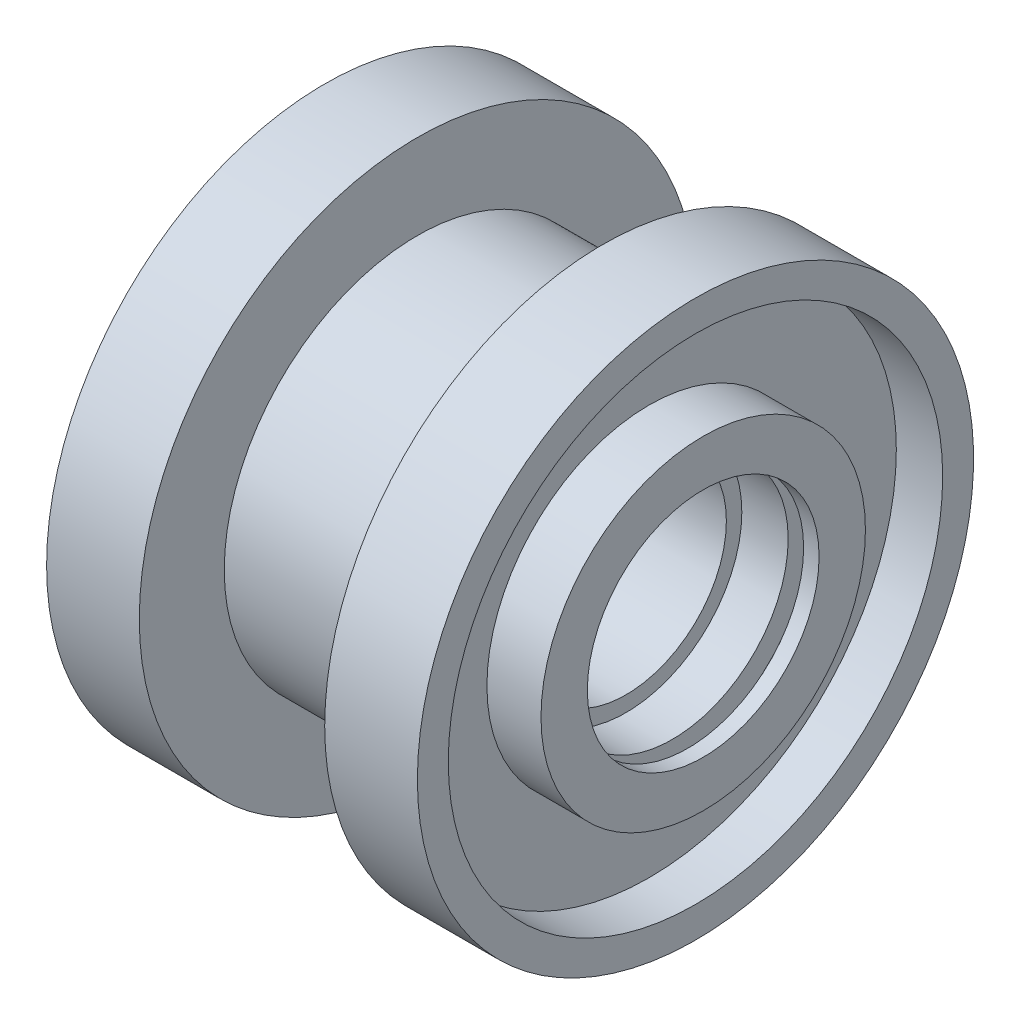
ISO-10303-21;
HEADER;
FILE_DESCRIPTION(('STEP AP214'),'2;1');
FILE_NAME('part.step','',(''),(''),'','','');
FILE_SCHEMA(('AUTOMOTIVE_DESIGN { 1 0 10303 214 1 1 1 1 }'));
ENDSEC;
DATA;
#1=APPLICATION_CONTEXT('core data for automotive mechanical design processes');
#2=APPLICATION_PROTOCOL_DEFINITION('international standard','automotive_design',2000,#1);
#3=PRODUCT_CONTEXT('',#1,'mechanical');
#4=PRODUCT('Part','Part','',(#3));
#5=PRODUCT_RELATED_PRODUCT_CATEGORY('part','',(#4));
#6=PRODUCT_DEFINITION_FORMATION('','',#4);
#7=PRODUCT_DEFINITION_CONTEXT('part definition',#1,'design');
#8=PRODUCT_DEFINITION('design','',#6,#7);
#9=PRODUCT_DEFINITION_SHAPE('','',#8);
#10=(LENGTH_UNIT() NAMED_UNIT(*) SI_UNIT(.MILLI.,.METRE.));
#11=(NAMED_UNIT(*) PLANE_ANGLE_UNIT() SI_UNIT($,.RADIAN.));
#12=(NAMED_UNIT(*) SI_UNIT($,.STERADIAN.) SOLID_ANGLE_UNIT());
#13=UNCERTAINTY_MEASURE_WITH_UNIT(LENGTH_MEASURE(1.E-05),#10,'distance_accuracy_value','');
#14=(GEOMETRIC_REPRESENTATION_CONTEXT(3) GLOBAL_UNCERTAINTY_ASSIGNED_CONTEXT((#13)) GLOBAL_UNIT_ASSIGNED_CONTEXT((#10,
#11,#12)) REPRESENTATION_CONTEXT('',''));
#15=CARTESIAN_POINT('',(0.,0.,0.));
#16=DIRECTION('',(0.,0.,1.));
#17=DIRECTION('',(1.,0.,0.));
#18=AXIS2_PLACEMENT_3D('',#15,#16,#17);
#19=CARTESIAN_POINT('',(-12.5,0.,0.));
#20=DIRECTION('',(-1.,0.,0.));
#21=DIRECTION('',(0.,0.,1.));
#22=AXIS2_PLACEMENT_3D('',#19,#20,#21);
#23=CYLINDRICAL_SURFACE('',#22,7.5);
#24=CARTESIAN_POINT('',(12.5,0.,0.));
#25=DIRECTION('',(-1.,0.,0.));
#26=DIRECTION('',(0.,0.,1.));
#27=AXIS2_PLACEMENT_3D('',#24,#25,#26);
#28=CIRCLE('',#27,7.5);
#29=CARTESIAN_POINT('',(12.5,0.,7.5));
#30=VERTEX_POINT('',#29);
#31=EDGE_CURVE('E125',#30,#30,#28,.T.);
#32=ORIENTED_EDGE('',*,*,#31,.F.);
#33=EDGE_LOOP('',(#32));
#34=FACE_BOUND('',#33,.T.);
#35=CARTESIAN_POINT('',(11.5,0.,0.));
#36=DIRECTION('',(-1.,0.,0.));
#37=DIRECTION('',(0.,0.,1.));
#38=AXIS2_PLACEMENT_3D('',#35,#36,#37);
#39=CIRCLE('',#38,7.5);
#40=CARTESIAN_POINT('',(11.5,0.,7.5));
#41=VERTEX_POINT('',#40);
#42=EDGE_CURVE('E10',#41,#41,#39,.T.);
#43=ORIENTED_EDGE('',*,*,#42,.T.);
#44=EDGE_LOOP('',(#43));
#45=FACE_BOUND('',#44,.T.);
#46=ADVANCED_FACE('F37',(#34,#45),#23,.F.);
#47=CARTESIAN_POINT('',(11.5,7.50000000000001,0.));
#48=DIRECTION('',(1.,0.,0.));
#49=DIRECTION('',(0.,0.,-1.));
#50=AXIS2_PLACEMENT_3D('',#47,#48,#49);
#51=PLANE('',#50);
#52=ORIENTED_EDGE('',*,*,#42,.F.);
#53=EDGE_LOOP('',(#52));
#54=FACE_BOUND('',#53,.T.);
#55=CARTESIAN_POINT('',(11.5,0.,0.));
#56=DIRECTION('',(-1.,0.,0.));
#57=DIRECTION('',(0.,0.,1.));
#58=AXIS2_PLACEMENT_3D('',#55,#56,#57);
#59=CIRCLE('',#58,8.9);
#60=CARTESIAN_POINT('',(11.5,0.,8.9));
#61=VERTEX_POINT('',#60);
#62=EDGE_CURVE('E43',#61,#61,#59,.T.);
#63=ORIENTED_EDGE('',*,*,#62,.T.);
#64=EDGE_LOOP('',(#63));
#65=FACE_BOUND('',#64,.T.);
#66=ADVANCED_FACE('F213',(#54,#65),#51,.F.);
#67=CARTESIAN_POINT('',(-12.5,0.,0.));
#68=DIRECTION('',(-1.,0.,0.));
#69=DIRECTION('',(0.,0.,1.));
#70=AXIS2_PLACEMENT_3D('',#67,#68,#69);
#71=CYLINDRICAL_SURFACE('',#70,8.9);
#72=ORIENTED_EDGE('',*,*,#62,.F.);
#73=EDGE_LOOP('',(#72));
#74=FACE_BOUND('',#73,.T.);
#75=CARTESIAN_POINT('',(10.5,0.,0.));
#76=DIRECTION('',(-1.,0.,0.));
#77=DIRECTION('',(0.,0.,1.));
#78=AXIS2_PLACEMENT_3D('',#75,#76,#77);
#79=CIRCLE('',#78,8.9);
#80=CARTESIAN_POINT('',(10.5,0.,8.9));
#81=VERTEX_POINT('',#80);
#82=EDGE_CURVE('E47',#81,#81,#79,.T.);
#83=ORIENTED_EDGE('',*,*,#82,.T.);
#84=EDGE_LOOP('',(#83));
#85=FACE_BOUND('',#84,.T.);
#86=ADVANCED_FACE('F217',(#74,#85),#71,.F.);
#87=CARTESIAN_POINT('',(10.5,8.90000000000001,0.));
#88=DIRECTION('',(-1.,0.,0.));
#89=DIRECTION('',(0.,0.,1.));
#90=AXIS2_PLACEMENT_3D('',#87,#88,#89);
#91=PLANE('',#90);
#92=ORIENTED_EDGE('',*,*,#82,.F.);
#93=EDGE_LOOP('',(#92));
#94=FACE_BOUND('',#93,.T.);
#95=CARTESIAN_POINT('',(10.5,0.,0.));
#96=DIRECTION('',(-1.,0.,0.));
#97=DIRECTION('',(0.,0.,1.));
#98=AXIS2_PLACEMENT_3D('',#95,#96,#97);
#99=CIRCLE('',#98,7.49999999999999);
#100=CARTESIAN_POINT('',(10.5,0.,7.49999999999999));
#101=VERTEX_POINT('',#100);
#102=EDGE_CURVE('E51',#101,#101,#99,.T.);
#103=ORIENTED_EDGE('',*,*,#102,.T.);
#104=EDGE_LOOP('',(#103));
#105=FACE_BOUND('',#104,.T.);
#106=ADVANCED_FACE('F222',(#94,#105),#91,.F.);
#107=CARTESIAN_POINT('',(-12.5,0.,0.));
#108=DIRECTION('',(-1.,0.,0.));
#109=DIRECTION('',(0.,0.,1.));
#110=AXIS2_PLACEMENT_3D('',#107,#108,#109);
#111=CYLINDRICAL_SURFACE('',#110,7.49999999999999);
#112=ORIENTED_EDGE('',*,*,#102,.F.);
#113=EDGE_LOOP('',(#112));
#114=FACE_BOUND('',#113,.T.);
#115=CARTESIAN_POINT('',(7.5,0.,0.));
#116=DIRECTION('',(-1.,0.,0.));
#117=DIRECTION('',(0.,0.,1.));
#118=AXIS2_PLACEMENT_3D('',#115,#116,#117);
#119=CIRCLE('',#118,7.49999999999999);
#120=CARTESIAN_POINT('',(7.5,0.,7.49999999999999));
#121=VERTEX_POINT('',#120);
#122=EDGE_CURVE('E56',#121,#121,#119,.T.);
#123=ORIENTED_EDGE('',*,*,#122,.T.);
#124=EDGE_LOOP('',(#123));
#125=FACE_BOUND('',#124,.T.);
#126=ADVANCED_FACE('F228',(#114,#125),#111,.F.);
#127=CARTESIAN_POINT('',(7.5,7.5,0.));
#128=DIRECTION('',(-1.,0.,0.));
#129=DIRECTION('',(0.,0.,1.));
#130=AXIS2_PLACEMENT_3D('',#127,#128,#129);
#131=PLANE('',#130);
#132=ORIENTED_EDGE('',*,*,#122,.F.);
#133=EDGE_LOOP('',(#132));
#134=FACE_BOUND('',#133,.T.);
#135=CARTESIAN_POINT('',(7.5,0.,0.));
#136=DIRECTION('',(-1.,0.,0.));
#137=DIRECTION('',(0.,0.,1.));
#138=AXIS2_PLACEMENT_3D('',#135,#136,#137);
#139=CIRCLE('',#138,6.5);
#140=CARTESIAN_POINT('',(7.5,0.,6.5));
#141=VERTEX_POINT('',#140);
#142=EDGE_CURVE('E59',#141,#141,#139,.T.);
#143=ORIENTED_EDGE('',*,*,#142,.T.);
#144=EDGE_LOOP('',(#143));
#145=FACE_BOUND('',#144,.T.);
#146=ADVANCED_FACE('F232',(#134,#145),#131,.F.);
#147=CARTESIAN_POINT('',(-12.5,0.,0.));
#148=DIRECTION('',(-1.,0.,0.));
#149=DIRECTION('',(0.,0.,1.));
#150=AXIS2_PLACEMENT_3D('',#147,#148,#149);
#151=CYLINDRICAL_SURFACE('',#150,6.5);
#152=ORIENTED_EDGE('',*,*,#142,.F.);
#153=EDGE_LOOP('',(#152));
#154=FACE_BOUND('',#153,.T.);
#155=CARTESIAN_POINT('',(-7.5,0.,0.));
#156=DIRECTION('',(-1.,0.,0.));
#157=DIRECTION('',(0.,0.,1.));
#158=AXIS2_PLACEMENT_3D('',#155,#156,#157);
#159=CIRCLE('',#158,6.5);
#160=CARTESIAN_POINT('',(-7.5,0.,6.5));
#161=VERTEX_POINT('',#160);
#162=EDGE_CURVE('E62',#161,#161,#159,.T.);
#163=ORIENTED_EDGE('',*,*,#162,.T.);
#164=EDGE_LOOP('',(#163));
#165=FACE_BOUND('',#164,.T.);
#166=ADVANCED_FACE('F236',(#154,#165),#151,.F.);
#167=CARTESIAN_POINT('',(-7.5,7.5,0.));
#168=DIRECTION('',(1.,0.,0.));
#169=DIRECTION('',(0.,0.,-1.));
#170=AXIS2_PLACEMENT_3D('',#167,#168,#169);
#171=PLANE('',#170);
#172=ORIENTED_EDGE('',*,*,#162,.F.);
#173=EDGE_LOOP('',(#172));
#174=FACE_BOUND('',#173,.T.);
#175=CARTESIAN_POINT('',(-7.5,0.,0.));
#176=DIRECTION('',(-1.,0.,0.));
#177=DIRECTION('',(0.,0.,1.));
#178=AXIS2_PLACEMENT_3D('',#175,#176,#177);
#179=CIRCLE('',#178,7.49999999999999);
#180=CARTESIAN_POINT('',(-7.5,0.,7.49999999999999));
#181=VERTEX_POINT('',#180);
#182=EDGE_CURVE('E65',#181,#181,#179,.T.);
#183=ORIENTED_EDGE('',*,*,#182,.T.);
#184=EDGE_LOOP('',(#183));
#185=FACE_BOUND('',#184,.T.);
#186=ADVANCED_FACE('F240',(#174,#185),#171,.F.);
#187=CARTESIAN_POINT('',(-12.5,0.,0.));
#188=DIRECTION('',(-1.,0.,0.));
#189=DIRECTION('',(0.,0.,1.));
#190=AXIS2_PLACEMENT_3D('',#187,#188,#189);
#191=CYLINDRICAL_SURFACE('',#190,7.49999999999999);
#192=ORIENTED_EDGE('',*,*,#182,.F.);
#193=EDGE_LOOP('',(#192));
#194=FACE_BOUND('',#193,.T.);
#195=CARTESIAN_POINT('',(-10.5,0.,0.));
#196=DIRECTION('',(-1.,0.,0.));
#197=DIRECTION('',(0.,0.,1.));
#198=AXIS2_PLACEMENT_3D('',#195,#196,#197);
#199=CIRCLE('',#198,7.49999999999999);
#200=CARTESIAN_POINT('',(-10.5,0.,7.49999999999999));
#201=VERTEX_POINT('',#200);
#202=EDGE_CURVE('E68',#201,#201,#199,.T.);
#203=ORIENTED_EDGE('',*,*,#202,.T.);
#204=EDGE_LOOP('',(#203));
#205=FACE_BOUND('',#204,.T.);
#206=ADVANCED_FACE('F244',(#194,#205),#191,.F.);
#207=CARTESIAN_POINT('',(-10.5,8.90000000000001,0.));
#208=DIRECTION('',(1.,0.,0.));
#209=DIRECTION('',(0.,0.,-1.));
#210=AXIS2_PLACEMENT_3D('',#207,#208,#209);
#211=PLANE('',#210);
#212=ORIENTED_EDGE('',*,*,#202,.F.);
#213=EDGE_LOOP('',(#212));
#214=FACE_BOUND('',#213,.T.);
#215=CARTESIAN_POINT('',(-10.5,0.,0.));
#216=DIRECTION('',(-1.,0.,0.));
#217=DIRECTION('',(0.,0.,1.));
#218=AXIS2_PLACEMENT_3D('',#215,#216,#217);
#219=CIRCLE('',#218,8.9);
#220=CARTESIAN_POINT('',(-10.5,0.,8.9));
#221=VERTEX_POINT('',#220);
#222=EDGE_CURVE('E71',#221,#221,#219,.T.);
#223=ORIENTED_EDGE('',*,*,#222,.T.);
#224=EDGE_LOOP('',(#223));
#225=FACE_BOUND('',#224,.T.);
#226=ADVANCED_FACE('F248',(#214,#225),#211,.F.);
#227=CARTESIAN_POINT('',(-12.5,0.,0.));
#228=DIRECTION('',(-1.,0.,0.));
#229=DIRECTION('',(0.,0.,1.));
#230=AXIS2_PLACEMENT_3D('',#227,#228,#229);
#231=CYLINDRICAL_SURFACE('',#230,8.9);
#232=ORIENTED_EDGE('',*,*,#222,.F.);
#233=EDGE_LOOP('',(#232));
#234=FACE_BOUND('',#233,.T.);
#235=CARTESIAN_POINT('',(-11.5,0.,0.));
#236=DIRECTION('',(-1.,0.,0.));
#237=DIRECTION('',(0.,0.,1.));
#238=AXIS2_PLACEMENT_3D('',#235,#236,#237);
#239=CIRCLE('',#238,8.9);
#240=CARTESIAN_POINT('',(-11.5,0.,8.9));
#241=VERTEX_POINT('',#240);
#242=EDGE_CURVE('E74',#241,#241,#239,.T.);
#243=ORIENTED_EDGE('',*,*,#242,.T.);
#244=EDGE_LOOP('',(#243));
#245=FACE_BOUND('',#244,.T.);
#246=ADVANCED_FACE('F252',(#234,#245),#231,.F.);
#247=CARTESIAN_POINT('',(-11.5,7.50000000000001,0.));
#248=DIRECTION('',(-1.,0.,0.));
#249=DIRECTION('',(0.,0.,1.));
#250=AXIS2_PLACEMENT_3D('',#247,#248,#249);
#251=PLANE('',#250);
#252=ORIENTED_EDGE('',*,*,#242,.F.);
#253=EDGE_LOOP('',(#252));
#254=FACE_BOUND('',#253,.T.);
#255=CARTESIAN_POINT('',(-11.5,0.,0.));
#256=DIRECTION('',(-1.,0.,0.));
#257=DIRECTION('',(0.,0.,1.));
#258=AXIS2_PLACEMENT_3D('',#255,#256,#257);
#259=CIRCLE('',#258,7.5);
#260=CARTESIAN_POINT('',(-11.5,0.,7.5));
#261=VERTEX_POINT('',#260);
#262=EDGE_CURVE('E77',#261,#261,#259,.T.);
#263=ORIENTED_EDGE('',*,*,#262,.T.);
#264=EDGE_LOOP('',(#263));
#265=FACE_BOUND('',#264,.T.);
#266=ADVANCED_FACE('F256',(#254,#265),#251,.F.);
#267=CARTESIAN_POINT('',(-12.5,0.,0.));
#268=DIRECTION('',(-1.,0.,0.));
#269=DIRECTION('',(0.,0.,1.));
#270=AXIS2_PLACEMENT_3D('',#267,#268,#269);
#271=CYLINDRICAL_SURFACE('',#270,7.5);
#272=ORIENTED_EDGE('',*,*,#262,.F.);
#273=EDGE_LOOP('',(#272));
#274=FACE_BOUND('',#273,.T.);
#275=CARTESIAN_POINT('',(-12.5,0.,0.));
#276=DIRECTION('',(-1.,0.,0.));
#277=DIRECTION('',(0.,0.,1.));
#278=AXIS2_PLACEMENT_3D('',#275,#276,#277);
#279=CIRCLE('',#278,7.49999999999999);
#280=CARTESIAN_POINT('',(-12.5,0.,7.49999999999999));
#281=VERTEX_POINT('',#280);
#282=EDGE_CURVE('E80',#281,#281,#279,.T.);
#283=ORIENTED_EDGE('',*,*,#282,.T.);
#284=EDGE_LOOP('',(#283));
#285=FACE_BOUND('',#284,.T.);
#286=ADVANCED_FACE('F260',(#274,#285),#271,.F.);
#287=CARTESIAN_POINT('',(-12.5,7.5,0.));
#288=DIRECTION('',(1.,0.,0.));
#289=DIRECTION('',(0.,0.,-1.));
#290=AXIS2_PLACEMENT_3D('',#287,#288,#289);
#291=PLANE('',#290);
#292=ORIENTED_EDGE('',*,*,#282,.F.);
#293=EDGE_LOOP('',(#292));
#294=FACE_BOUND('',#293,.T.);
#295=CARTESIAN_POINT('',(-12.5,0.,0.));
#296=DIRECTION('',(-1.,0.,0.));
#297=DIRECTION('',(0.,0.,1.));
#298=AXIS2_PLACEMENT_3D('',#295,#296,#297);
#299=CIRCLE('',#298,10.5);
#300=CARTESIAN_POINT('',(-12.5,0.,10.5));
#301=VERTEX_POINT('',#300);
#302=EDGE_CURVE('E83',#301,#301,#299,.T.);
#303=ORIENTED_EDGE('',*,*,#302,.T.);
#304=EDGE_LOOP('',(#303));
#305=FACE_BOUND('',#304,.T.);
#306=ADVANCED_FACE('F264',(#294,#305),#291,.F.);
#307=CARTESIAN_POINT('',(-12.5,0.,0.));
#308=DIRECTION('',(-1.,0.,0.));
#309=DIRECTION('',(0.,0.,1.));
#310=AXIS2_PLACEMENT_3D('',#307,#308,#309);
#311=CYLINDRICAL_SURFACE('',#310,10.5);
#312=ORIENTED_EDGE('',*,*,#302,.F.);
#313=EDGE_LOOP('',(#312));
#314=FACE_BOUND('',#313,.T.);
#315=CARTESIAN_POINT('',(-9.,0.,0.));
#316=DIRECTION('',(-1.,0.,0.));
#317=DIRECTION('',(0.,0.,1.));
#318=AXIS2_PLACEMENT_3D('',#315,#316,#317);
#319=CIRCLE('',#318,10.5);
#320=CARTESIAN_POINT('',(-9.,0.,10.5));
#321=VERTEX_POINT('',#320);
#322=EDGE_CURVE('E86',#321,#321,#319,.T.);
#323=ORIENTED_EDGE('',*,*,#322,.T.);
#324=EDGE_LOOP('',(#323));
#325=FACE_BOUND('',#324,.T.);
#326=ADVANCED_FACE('F268',(#314,#325),#311,.T.);
#327=CARTESIAN_POINT('',(-9.,16.,0.));
#328=DIRECTION('',(1.,0.,0.));
#329=DIRECTION('',(0.,0.,-1.));
#330=AXIS2_PLACEMENT_3D('',#327,#328,#329);
#331=PLANE('',#330);
#332=ORIENTED_EDGE('',*,*,#322,.F.);
#333=EDGE_LOOP('',(#332));
#334=FACE_BOUND('',#333,.T.);
#335=CARTESIAN_POINT('',(-9.,0.,0.));
#336=DIRECTION('',(-1.,0.,0.));
#337=DIRECTION('',(0.,0.,1.));
#338=AXIS2_PLACEMENT_3D('',#335,#336,#337);
#339=CIRCLE('',#338,16.);
#340=CARTESIAN_POINT('',(-9.,0.,16.));
#341=VERTEX_POINT('',#340);
#342=EDGE_CURVE('E89',#341,#341,#339,.T.);
#343=ORIENTED_EDGE('',*,*,#342,.T.);
#344=EDGE_LOOP('',(#343));
#345=FACE_BOUND('',#344,.T.);
#346=ADVANCED_FACE('F272',(#334,#345),#331,.F.);
#347=CARTESIAN_POINT('',(-12.5,0.,0.));
#348=DIRECTION('',(-1.,0.,0.));
#349=DIRECTION('',(0.,0.,1.));
#350=AXIS2_PLACEMENT_3D('',#347,#348,#349);
#351=CYLINDRICAL_SURFACE('',#350,16.);
#352=ORIENTED_EDGE('',*,*,#342,.F.);
#353=EDGE_LOOP('',(#352));
#354=FACE_BOUND('',#353,.T.);
#355=CARTESIAN_POINT('',(-12.,0.,0.));
#356=DIRECTION('',(-1.,0.,0.));
#357=DIRECTION('',(0.,0.,1.));
#358=AXIS2_PLACEMENT_3D('',#355,#356,#357);
#359=CIRCLE('',#358,16.);
#360=CARTESIAN_POINT('',(-12.,0.,16.));
#361=VERTEX_POINT('',#360);
#362=EDGE_CURVE('E92',#361,#361,#359,.T.);
#363=ORIENTED_EDGE('',*,*,#362,.T.);
#364=EDGE_LOOP('',(#363));
#365=FACE_BOUND('',#364,.T.);
#366=ADVANCED_FACE('F148',(#354,#365),#351,.F.);
#367=CARTESIAN_POINT('',(-12.,18.,0.));
#368=DIRECTION('',(1.,0.,0.));
#369=DIRECTION('',(0.,0.,-1.));
#370=AXIS2_PLACEMENT_3D('',#367,#368,#369);
#371=PLANE('',#370);
#372=CARTESIAN_POINT('',(-12.,17.,0.));
#373=DIRECTION('',(-1.,0.,0.));
#374=DIRECTION('',(0.,0.,1.));
#375=AXIS2_PLACEMENT_3D('',#372,#373,#374);
#376=CIRCLE('',#375,0.5);
#377=CARTESIAN_POINT('',(-12.,17.,0.5));
#378=VERTEX_POINT('',#377);
#379=EDGE_CURVE('E129',#378,#378,#376,.T.);
#380=ORIENTED_EDGE('',*,*,#379,.F.);
#381=EDGE_LOOP('',(#380));
#382=FACE_BOUND('',#381,.T.);
#383=ORIENTED_EDGE('',*,*,#362,.F.);
#384=EDGE_LOOP('',(#383));
#385=FACE_BOUND('',#384,.T.);
#386=CARTESIAN_POINT('',(-12.,0.,0.));
#387=DIRECTION('',(-1.,0.,0.));
#388=DIRECTION('',(0.,0.,1.));
#389=AXIS2_PLACEMENT_3D('',#386,#387,#388);
#390=CIRCLE('',#389,18.);
#391=CARTESIAN_POINT('',(-12.,0.,18.));
#392=VERTEX_POINT('',#391);
#393=EDGE_CURVE('E95',#392,#392,#390,.T.);
#394=ORIENTED_EDGE('',*,*,#393,.T.);
#395=EDGE_LOOP('',(#394));
#396=FACE_BOUND('',#395,.T.);
#397=ADVANCED_FACE('F144',(#382,#385,#396),#371,.F.);
#398=CARTESIAN_POINT('',(-12.5,0.,0.));
#399=DIRECTION('',(-1.,0.,0.));
#400=DIRECTION('',(0.,0.,1.));
#401=AXIS2_PLACEMENT_3D('',#398,#399,#400);
#402=CYLINDRICAL_SURFACE('',#401,18.);
#403=ORIENTED_EDGE('',*,*,#393,.F.);
#404=EDGE_LOOP('',(#403));
#405=FACE_BOUND('',#404,.T.);
#406=CARTESIAN_POINT('',(-6.,0.,0.));
#407=DIRECTION('',(-1.,0.,0.));
#408=DIRECTION('',(0.,0.,1.));
#409=AXIS2_PLACEMENT_3D('',#406,#407,#408);
#410=CIRCLE('',#409,18.);
#411=CARTESIAN_POINT('',(-6.,0.,18.));
#412=VERTEX_POINT('',#411);
#413=EDGE_CURVE('E98',#412,#412,#410,.T.);
#414=ORIENTED_EDGE('',*,*,#413,.T.);
#415=EDGE_LOOP('',(#414));
#416=FACE_BOUND('',#415,.T.);
#417=ADVANCED_FACE('F147',(#405,#416),#402,.T.);
#418=CARTESIAN_POINT('',(-6.,12.5,0.));
#419=DIRECTION('',(-1.,0.,0.));
#420=DIRECTION('',(0.,0.,1.));
#421=AXIS2_PLACEMENT_3D('',#418,#419,#420);
#422=PLANE('',#421);
#423=ORIENTED_EDGE('',*,*,#413,.F.);
#424=EDGE_LOOP('',(#423));
#425=FACE_BOUND('',#424,.T.);
#426=CARTESIAN_POINT('',(-6.,0.,0.));
#427=DIRECTION('',(-1.,0.,0.));
#428=DIRECTION('',(0.,0.,1.));
#429=AXIS2_PLACEMENT_3D('',#426,#427,#428);
#430=CIRCLE('',#429,12.5);
#431=CARTESIAN_POINT('',(-6.,0.,12.5));
#432=VERTEX_POINT('',#431);
#433=EDGE_CURVE('E101',#432,#432,#430,.T.);
#434=ORIENTED_EDGE('',*,*,#433,.T.);
#435=EDGE_LOOP('',(#434));
#436=FACE_BOUND('',#435,.T.);
#437=ADVANCED_FACE('F156',(#425,#436),#422,.F.);
#438=CARTESIAN_POINT('',(-12.5,0.,0.));
#439=DIRECTION('',(-1.,0.,0.));
#440=DIRECTION('',(0.,0.,1.));
#441=AXIS2_PLACEMENT_3D('',#438,#439,#440);
#442=CYLINDRICAL_SURFACE('',#441,12.5);
#443=ORIENTED_EDGE('',*,*,#433,.F.);
#444=EDGE_LOOP('',(#443));
#445=FACE_BOUND('',#444,.T.);
#446=CARTESIAN_POINT('',(6.,0.,0.));
#447=DIRECTION('',(-1.,0.,0.));
#448=DIRECTION('',(0.,0.,1.));
#449=AXIS2_PLACEMENT_3D('',#446,#447,#448);
#450=CIRCLE('',#449,12.5);
#451=CARTESIAN_POINT('',(6.,0.,12.5));
#452=VERTEX_POINT('',#451);
#453=EDGE_CURVE('E104',#452,#452,#450,.T.);
#454=ORIENTED_EDGE('',*,*,#453,.T.);
#455=EDGE_LOOP('',(#454));
#456=FACE_BOUND('',#455,.T.);
#457=ADVANCED_FACE('F162',(#445,#456),#442,.T.);
#458=CARTESIAN_POINT('',(6.,12.5,0.));
#459=DIRECTION('',(1.,0.,0.));
#460=DIRECTION('',(0.,0.,-1.));
#461=AXIS2_PLACEMENT_3D('',#458,#459,#460);
#462=PLANE('',#461);
#463=ORIENTED_EDGE('',*,*,#453,.F.);
#464=EDGE_LOOP('',(#463));
#465=FACE_BOUND('',#464,.T.);
#466=CARTESIAN_POINT('',(6.,0.,0.));
#467=DIRECTION('',(-1.,0.,0.));
#468=DIRECTION('',(0.,0.,1.));
#469=AXIS2_PLACEMENT_3D('',#466,#467,#468);
#470=CIRCLE('',#469,18.);
#471=CARTESIAN_POINT('',(6.,0.,18.));
#472=VERTEX_POINT('',#471);
#473=EDGE_CURVE('E107',#472,#472,#470,.T.);
#474=ORIENTED_EDGE('',*,*,#473,.T.);
#475=EDGE_LOOP('',(#474));
#476=FACE_BOUND('',#475,.T.);
#477=ADVANCED_FACE('F168',(#465,#476),#462,.F.);
#478=CARTESIAN_POINT('',(-12.5,0.,0.));
#479=DIRECTION('',(-1.,0.,0.));
#480=DIRECTION('',(0.,0.,1.));
#481=AXIS2_PLACEMENT_3D('',#478,#479,#480);
#482=CYLINDRICAL_SURFACE('',#481,18.);
#483=ORIENTED_EDGE('',*,*,#473,.F.);
#484=EDGE_LOOP('',(#483));
#485=FACE_BOUND('',#484,.T.);
#486=CARTESIAN_POINT('',(12.,0.,0.));
#487=DIRECTION('',(-1.,0.,0.));
#488=DIRECTION('',(0.,0.,1.));
#489=AXIS2_PLACEMENT_3D('',#486,#487,#488);
#490=CIRCLE('',#489,18.);
#491=CARTESIAN_POINT('',(12.,0.,18.));
#492=VERTEX_POINT('',#491);
#493=EDGE_CURVE('E110',#492,#492,#490,.T.);
#494=ORIENTED_EDGE('',*,*,#493,.T.);
#495=EDGE_LOOP('',(#494));
#496=FACE_BOUND('',#495,.T.);
#497=ADVANCED_FACE('F174',(#485,#496),#482,.T.);
#498=CARTESIAN_POINT('',(12.,18.,0.));
#499=DIRECTION('',(-1.,0.,0.));
#500=DIRECTION('',(0.,0.,1.));
#501=AXIS2_PLACEMENT_3D('',#498,#499,#500);
#502=PLANE('',#501);
#503=ORIENTED_EDGE('',*,*,#493,.F.);
#504=EDGE_LOOP('',(#503));
#505=FACE_BOUND('',#504,.T.);
#506=CARTESIAN_POINT('',(12.,0.,0.));
#507=DIRECTION('',(-1.,0.,0.));
#508=DIRECTION('',(0.,0.,1.));
#509=AXIS2_PLACEMENT_3D('',#506,#507,#508);
#510=CIRCLE('',#509,16.);
#511=CARTESIAN_POINT('',(12.,0.,16.));
#512=VERTEX_POINT('',#511);
#513=EDGE_CURVE('E113',#512,#512,#510,.T.);
#514=ORIENTED_EDGE('',*,*,#513,.T.);
#515=EDGE_LOOP('',(#514));
#516=FACE_BOUND('',#515,.T.);
#517=ADVANCED_FACE('F180',(#505,#516),#502,.F.);
#518=CARTESIAN_POINT('',(-12.5,0.,0.));
#519=DIRECTION('',(-1.,0.,0.));
#520=DIRECTION('',(0.,0.,1.));
#521=AXIS2_PLACEMENT_3D('',#518,#519,#520);
#522=CYLINDRICAL_SURFACE('',#521,16.);
#523=ORIENTED_EDGE('',*,*,#513,.F.);
#524=EDGE_LOOP('',(#523));
#525=FACE_BOUND('',#524,.T.);
#526=CARTESIAN_POINT('',(9.,0.,0.));
#527=DIRECTION('',(-1.,0.,0.));
#528=DIRECTION('',(0.,0.,1.));
#529=AXIS2_PLACEMENT_3D('',#526,#527,#528);
#530=CIRCLE('',#529,16.);
#531=CARTESIAN_POINT('',(9.,0.,16.));
#532=VERTEX_POINT('',#531);
#533=EDGE_CURVE('E116',#532,#532,#530,.T.);
#534=ORIENTED_EDGE('',*,*,#533,.T.);
#535=EDGE_LOOP('',(#534));
#536=FACE_BOUND('',#535,.T.);
#537=ADVANCED_FACE('F186',(#525,#536),#522,.F.);
#538=CARTESIAN_POINT('',(9.,16.,0.));
#539=DIRECTION('',(-1.,0.,0.));
#540=DIRECTION('',(0.,0.,1.));
#541=AXIS2_PLACEMENT_3D('',#538,#539,#540);
#542=PLANE('',#541);
#543=ORIENTED_EDGE('',*,*,#533,.F.);
#544=EDGE_LOOP('',(#543));
#545=FACE_BOUND('',#544,.T.);
#546=CARTESIAN_POINT('',(9.,0.,0.));
#547=DIRECTION('',(-1.,0.,0.));
#548=DIRECTION('',(0.,0.,1.));
#549=AXIS2_PLACEMENT_3D('',#546,#547,#548);
#550=CIRCLE('',#549,10.5);
#551=CARTESIAN_POINT('',(9.,0.,10.5));
#552=VERTEX_POINT('',#551);
#553=EDGE_CURVE('E119',#552,#552,#550,.T.);
#554=ORIENTED_EDGE('',*,*,#553,.T.);
#555=EDGE_LOOP('',(#554));
#556=FACE_BOUND('',#555,.T.);
#557=ADVANCED_FACE('F192',(#545,#556),#542,.F.);
#558=CARTESIAN_POINT('',(-12.5,0.,0.));
#559=DIRECTION('',(-1.,0.,0.));
#560=DIRECTION('',(0.,0.,1.));
#561=AXIS2_PLACEMENT_3D('',#558,#559,#560);
#562=CYLINDRICAL_SURFACE('',#561,10.5);
#563=ORIENTED_EDGE('',*,*,#553,.F.);
#564=EDGE_LOOP('',(#563));
#565=FACE_BOUND('',#564,.T.);
#566=CARTESIAN_POINT('',(12.5,0.,0.));
#567=DIRECTION('',(-1.,0.,0.));
#568=DIRECTION('',(0.,0.,1.));
#569=AXIS2_PLACEMENT_3D('',#566,#567,#568);
#570=CIRCLE('',#569,10.5);
#571=CARTESIAN_POINT('',(12.5,0.,10.5));
#572=VERTEX_POINT('',#571);
#573=EDGE_CURVE('E122',#572,#572,#570,.T.);
#574=ORIENTED_EDGE('',*,*,#573,.T.);
#575=EDGE_LOOP('',(#574));
#576=FACE_BOUND('',#575,.T.);
#577=ADVANCED_FACE('F198',(#565,#576),#562,.T.);
#578=CARTESIAN_POINT('',(12.5,7.50000000000001,0.));
#579=DIRECTION('',(-1.,0.,0.));
#580=DIRECTION('',(0.,0.,1.));
#581=AXIS2_PLACEMENT_3D('',#578,#579,#580);
#582=PLANE('',#581);
#583=ORIENTED_EDGE('',*,*,#573,.F.);
#584=EDGE_LOOP('',(#583));
#585=FACE_BOUND('',#584,.T.);
#586=ORIENTED_EDGE('',*,*,#31,.T.);
#587=EDGE_LOOP('',(#586));
#588=FACE_BOUND('',#587,.T.);
#589=ADVANCED_FACE('F140',(#585,#588),#582,.F.);
#590=CARTESIAN_POINT('',(-11.,17.,0.));
#591=DIRECTION('',(-1.,0.,0.));
#592=DIRECTION('',(0.,0.,1.));
#593=AXIS2_PLACEMENT_3D('',#590,#591,#592);
#594=CYLINDRICAL_SURFACE('',#593,0.5);
#595=CARTESIAN_POINT('',(-11.,17.,0.));
#596=DIRECTION('',(-1.,0.,0.));
#597=DIRECTION('',(0.,0.,1.));
#598=AXIS2_PLACEMENT_3D('',#595,#596,#597);
#599=CIRCLE('',#598,0.5);
#600=CARTESIAN_POINT('',(-11.,17.,0.5));
#601=VERTEX_POINT('',#600);
#602=EDGE_CURVE('E128',#601,#601,#599,.T.);
#603=ORIENTED_EDGE('',*,*,#602,.F.);
#604=EDGE_LOOP('',(#603));
#605=FACE_BOUND('',#604,.T.);
#606=ORIENTED_EDGE('',*,*,#379,.T.);
#607=EDGE_LOOP('',(#606));
#608=FACE_BOUND('',#607,.T.);
#609=ADVANCED_FACE('F137',(#605,#608),#594,.F.);
#610=CARTESIAN_POINT('',(-11.,17.,0.));
#611=DIRECTION('',(-1.,0.,0.));
#612=DIRECTION('',(0.,0.,1.));
#613=AXIS2_PLACEMENT_3D('',#610,#611,#612);
#614=PLANE('',#613);
#615=ORIENTED_EDGE('',*,*,#602,.T.);
#616=EDGE_LOOP('',(#615));
#617=FACE_BOUND('',#616,.T.);
#618=ADVANCED_FACE('F135',(#617),#614,.T.);
#619=CLOSED_SHELL('',(#46,#66,#86,#106,#126,#146,#166,#186,#206,#226,#246,#266,#286,#306,#326,
#346,#366,#397,#417,#437,#457,#477,#497,#517,#537,#557,#577,#589,#609,#618));
#620=MANIFOLD_SOLID_BREP('B2',#619);
#621=ADVANCED_BREP_SHAPE_REPRESENTATION('',(#18,#620),#14);
#622=SHAPE_DEFINITION_REPRESENTATION(#9,#621);
ENDSEC;
END-ISO-10303-21;
